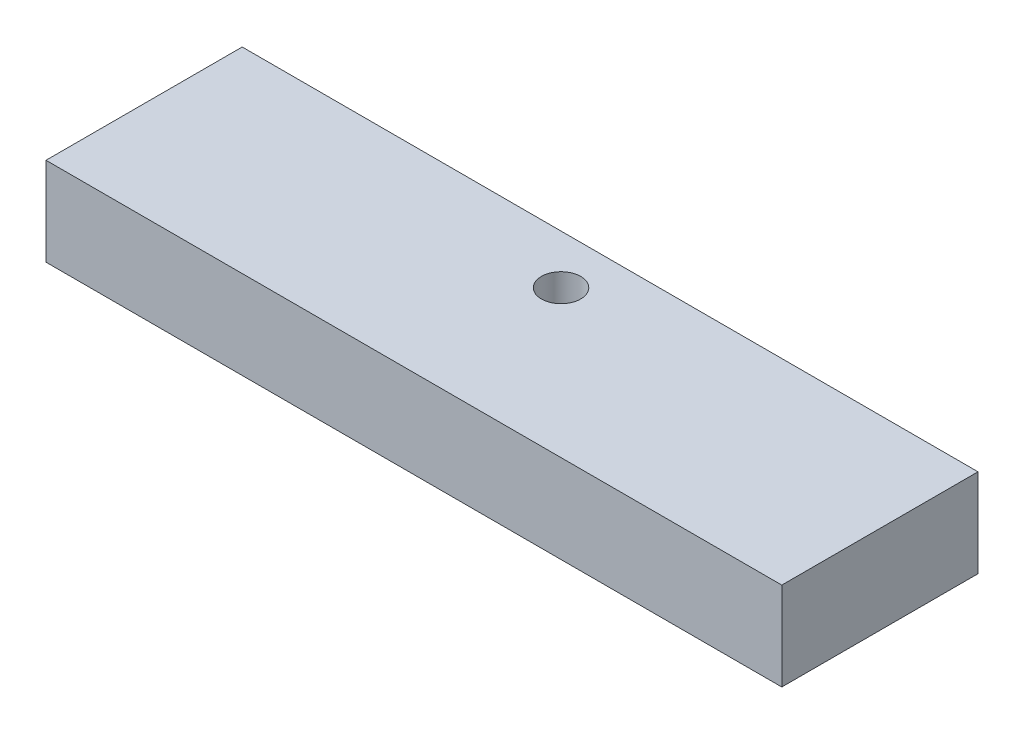
ISO-10303-21;
HEADER;
FILE_DESCRIPTION(('STEP AP214'),'2;1');
FILE_NAME('part.step','',(''),(''),'','','');
FILE_SCHEMA(('AUTOMOTIVE_DESIGN { 1 0 10303 214 1 1 1 1 }'));
ENDSEC;
DATA;
#1=APPLICATION_CONTEXT('core data for automotive mechanical design processes');
#2=APPLICATION_PROTOCOL_DEFINITION('international standard','automotive_design',2000,#1);
#3=PRODUCT_CONTEXT('',#1,'mechanical');
#4=PRODUCT('Part','Part','',(#3));
#5=PRODUCT_RELATED_PRODUCT_CATEGORY('part','',(#4));
#6=PRODUCT_DEFINITION_FORMATION('','',#4);
#7=PRODUCT_DEFINITION_CONTEXT('part definition',#1,'design');
#8=PRODUCT_DEFINITION('design','',#6,#7);
#9=PRODUCT_DEFINITION_SHAPE('','',#8);
#10=(LENGTH_UNIT() NAMED_UNIT(*) SI_UNIT(.MILLI.,.METRE.));
#11=(NAMED_UNIT(*) PLANE_ANGLE_UNIT() SI_UNIT($,.RADIAN.));
#12=(NAMED_UNIT(*) SI_UNIT($,.STERADIAN.) SOLID_ANGLE_UNIT());
#13=UNCERTAINTY_MEASURE_WITH_UNIT(LENGTH_MEASURE(1.E-05),#10,'distance_accuracy_value','');
#14=(GEOMETRIC_REPRESENTATION_CONTEXT(3) GLOBAL_UNCERTAINTY_ASSIGNED_CONTEXT((#13)) GLOBAL_UNIT_ASSIGNED_CONTEXT((#10,
#11,#12)) REPRESENTATION_CONTEXT('',''));
#15=CARTESIAN_POINT('',(0.,0.,0.));
#16=DIRECTION('',(0.,0.,1.));
#17=DIRECTION('',(1.,0.,0.));
#18=AXIS2_PLACEMENT_3D('',#15,#16,#17);
#19=CARTESIAN_POINT('',(0.,18.,0.));
#20=DIRECTION('',(0.,-1.,0.));
#21=DIRECTION('',(0.,0.,-1.));
#22=AXIS2_PLACEMENT_3D('',#19,#20,#21);
#23=PLANE('',#22);
#24=DIRECTION('',(0.,0.,-1.));
#25=VECTOR('',#24,1.);
#26=CARTESIAN_POINT('',(75.,18.,20.));
#27=LINE('',#26,#25);
#28=CARTESIAN_POINT('',(75.,18.,20.));
#29=VERTEX_POINT('',#28);
#30=CARTESIAN_POINT('',(75.,18.,-20.));
#31=VERTEX_POINT('',#30);
#32=EDGE_CURVE('E84',#29,#31,#27,.T.);
#33=ORIENTED_EDGE('',*,*,#32,.T.);
#34=DIRECTION('',(-1.,0.,0.));
#35=VECTOR('',#34,1.);
#36=CARTESIAN_POINT('',(-75.,18.,-20.));
#37=LINE('',#36,#35);
#38=CARTESIAN_POINT('',(-75.,18.,-20.));
#39=VERTEX_POINT('',#38);
#40=EDGE_CURVE('E79',#31,#39,#37,.T.);
#41=ORIENTED_EDGE('',*,*,#40,.T.);
#42=DIRECTION('',(0.,0.,1.));
#43=VECTOR('',#42,1.);
#44=CARTESIAN_POINT('',(-75.,18.,20.));
#45=LINE('',#44,#43);
#46=CARTESIAN_POINT('',(-75.,18.,20.));
#47=VERTEX_POINT('',#46);
#48=EDGE_CURVE('E82',#39,#47,#45,.T.);
#49=ORIENTED_EDGE('',*,*,#48,.T.);
#50=DIRECTION('',(1.,0.,0.));
#51=VECTOR('',#50,1.);
#52=CARTESIAN_POINT('',(-75.,18.,20.));
#53=LINE('',#52,#51);
#54=EDGE_CURVE('E49',#47,#29,#53,.T.);
#55=ORIENTED_EDGE('',*,*,#54,.T.);
#56=EDGE_LOOP('',(#33,#41,#49,#55));
#57=FACE_BOUND('',#56,.T.);
#58=CARTESIAN_POINT('',(0.,18.,-10.));
#59=DIRECTION('',(0.,1.,0.));
#60=DIRECTION('',(0.,0.,1.));
#61=AXIS2_PLACEMENT_3D('',#58,#59,#60);
#62=CIRCLE('',#61,4.);
#63=CARTESIAN_POINT('',(0.,18.,-6.00000000000002));
#64=VERTEX_POINT('',#63);
#65=EDGE_CURVE('E99',#64,#64,#62,.T.);
#66=ORIENTED_EDGE('',*,*,#65,.F.);
#67=EDGE_LOOP('',(#66));
#68=FACE_BOUND('',#67,.T.);
#69=ADVANCED_FACE('F32',(#57,#68),#23,.F.);
#70=CARTESIAN_POINT('',(0.,0.,0.));
#71=DIRECTION('',(0.,-1.,0.));
#72=DIRECTION('',(0.,0.,-1.));
#73=AXIS2_PLACEMENT_3D('',#70,#71,#72);
#74=PLANE('',#73);
#75=DIRECTION('',(0.,0.,-1.));
#76=VECTOR('',#75,1.);
#77=CARTESIAN_POINT('',(75.,0.,20.));
#78=LINE('',#77,#76);
#79=CARTESIAN_POINT('',(75.,0.,20.));
#80=VERTEX_POINT('',#79);
#81=CARTESIAN_POINT('',(75.,0.,-20.));
#82=VERTEX_POINT('',#81);
#83=EDGE_CURVE('E96',#80,#82,#78,.T.);
#84=ORIENTED_EDGE('',*,*,#83,.F.);
#85=DIRECTION('',(1.,0.,0.));
#86=VECTOR('',#85,1.);
#87=CARTESIAN_POINT('',(-75.,0.,20.));
#88=LINE('',#87,#86);
#89=CARTESIAN_POINT('',(-75.,0.,20.));
#90=VERTEX_POINT('',#89);
#91=EDGE_CURVE('E72',#90,#80,#88,.T.);
#92=ORIENTED_EDGE('',*,*,#91,.F.);
#93=DIRECTION('',(0.,0.,1.));
#94=VECTOR('',#93,1.);
#95=CARTESIAN_POINT('',(-75.,0.,20.));
#96=LINE('',#95,#94);
#97=CARTESIAN_POINT('',(-75.,0.,-20.));
#98=VERTEX_POINT('',#97);
#99=EDGE_CURVE('E66',#98,#90,#96,.T.);
#100=ORIENTED_EDGE('',*,*,#99,.F.);
#101=DIRECTION('',(-1.,0.,0.));
#102=VECTOR('',#101,1.);
#103=CARTESIAN_POINT('',(-75.,0.,-20.));
#104=LINE('',#103,#102);
#105=EDGE_CURVE('E88',#82,#98,#104,.T.);
#106=ORIENTED_EDGE('',*,*,#105,.F.);
#107=EDGE_LOOP('',(#84,#92,#100,#106));
#108=FACE_BOUND('',#107,.T.);
#109=CARTESIAN_POINT('',(0.,0.,-10.));
#110=DIRECTION('',(0.,1.,0.));
#111=DIRECTION('',(0.,0.,1.));
#112=AXIS2_PLACEMENT_3D('',#109,#110,#111);
#113=CIRCLE('',#112,4.);
#114=CARTESIAN_POINT('',(0.,0.,-6.00000000000002));
#115=VERTEX_POINT('',#114);
#116=EDGE_CURVE('E111',#115,#115,#113,.T.);
#117=ORIENTED_EDGE('',*,*,#116,.T.);
#118=EDGE_LOOP('',(#117));
#119=FACE_BOUND('',#118,.T.);
#120=ADVANCED_FACE('F107',(#108,#119),#74,.T.);
#121=CARTESIAN_POINT('',(75.,18.,20.));
#122=DIRECTION('',(-1.,0.,0.));
#123=DIRECTION('',(0.,0.,1.));
#124=AXIS2_PLACEMENT_3D('',#121,#122,#123);
#125=PLANE('',#124);
#126=ORIENTED_EDGE('',*,*,#83,.T.);
#127=DIRECTION('',(0.,-1.,0.));
#128=VECTOR('',#127,1.);
#129=CARTESIAN_POINT('',(75.,18.,-20.));
#130=LINE('',#129,#128);
#131=EDGE_CURVE('E11',#31,#82,#130,.T.);
#132=ORIENTED_EDGE('',*,*,#131,.F.);
#133=ORIENTED_EDGE('',*,*,#32,.F.);
#134=DIRECTION('',(0.,-1.,0.));
#135=VECTOR('',#134,1.);
#136=CARTESIAN_POINT('',(75.,18.,20.));
#137=LINE('',#136,#135);
#138=EDGE_CURVE('E92',#29,#80,#137,.T.);
#139=ORIENTED_EDGE('',*,*,#138,.T.);
#140=EDGE_LOOP('',(#126,#132,#133,#139));
#141=FACE_BOUND('',#140,.T.);
#142=ADVANCED_FACE('F34',(#141),#125,.F.);
#143=CARTESIAN_POINT('',(-75.,18.,-20.));
#144=DIRECTION('',(0.,0.,1.));
#145=DIRECTION('',(1.,0.,0.));
#146=AXIS2_PLACEMENT_3D('',#143,#144,#145);
#147=PLANE('',#146);
#148=ORIENTED_EDGE('',*,*,#105,.T.);
#149=DIRECTION('',(0.,-1.,0.));
#150=VECTOR('',#149,1.);
#151=CARTESIAN_POINT('',(-75.,18.,-20.));
#152=LINE('',#151,#150);
#153=EDGE_CURVE('E41',#39,#98,#152,.T.);
#154=ORIENTED_EDGE('',*,*,#153,.F.);
#155=ORIENTED_EDGE('',*,*,#40,.F.);
#156=ORIENTED_EDGE('',*,*,#131,.T.);
#157=EDGE_LOOP('',(#148,#154,#155,#156));
#158=FACE_BOUND('',#157,.T.);
#159=ADVANCED_FACE('F87',(#158),#147,.F.);
#160=CARTESIAN_POINT('',(-75.,18.,20.));
#161=DIRECTION('',(1.,0.,0.));
#162=DIRECTION('',(0.,0.,-1.));
#163=AXIS2_PLACEMENT_3D('',#160,#161,#162);
#164=PLANE('',#163);
#165=ORIENTED_EDGE('',*,*,#99,.T.);
#166=DIRECTION('',(0.,-1.,0.));
#167=VECTOR('',#166,1.);
#168=CARTESIAN_POINT('',(-75.,18.,20.));
#169=LINE('',#168,#167);
#170=EDGE_CURVE('E89',#47,#90,#169,.T.);
#171=ORIENTED_EDGE('',*,*,#170,.F.);
#172=ORIENTED_EDGE('',*,*,#48,.F.);
#173=ORIENTED_EDGE('',*,*,#153,.T.);
#174=EDGE_LOOP('',(#165,#171,#172,#173));
#175=FACE_BOUND('',#174,.T.);
#176=ADVANCED_FACE('F90',(#175),#164,.F.);
#177=CARTESIAN_POINT('',(-75.,18.,20.));
#178=DIRECTION('',(0.,0.,-1.));
#179=DIRECTION('',(-1.,0.,0.));
#180=AXIS2_PLACEMENT_3D('',#177,#178,#179);
#181=PLANE('',#180);
#182=ORIENTED_EDGE('',*,*,#91,.T.);
#183=ORIENTED_EDGE('',*,*,#138,.F.);
#184=ORIENTED_EDGE('',*,*,#54,.F.);
#185=ORIENTED_EDGE('',*,*,#170,.T.);
#186=EDGE_LOOP('',(#182,#183,#184,#185));
#187=FACE_BOUND('',#186,.T.);
#188=ADVANCED_FACE('F104',(#187),#181,.F.);
#189=CARTESIAN_POINT('',(0.,18.,-10.));
#190=DIRECTION('',(0.,-1.,0.));
#191=DIRECTION('',(0.,0.,-1.));
#192=AXIS2_PLACEMENT_3D('',#189,#190,#191);
#193=CYLINDRICAL_SURFACE('',#192,4.);
#194=ORIENTED_EDGE('',*,*,#65,.T.);
#195=EDGE_LOOP('',(#194));
#196=FACE_BOUND('',#195,.T.);
#197=ORIENTED_EDGE('',*,*,#116,.F.);
#198=EDGE_LOOP('',(#197));
#199=FACE_BOUND('',#198,.T.);
#200=ADVANCED_FACE('F117',(#196,#199),#193,.F.);
#201=CLOSED_SHELL('',(#69,#120,#142,#159,#176,#188,#200));
#202=MANIFOLD_SOLID_BREP('B2',#201);
#203=ADVANCED_BREP_SHAPE_REPRESENTATION('',(#18,#202),#14);
#204=SHAPE_DEFINITION_REPRESENTATION(#9,#203);
ENDSEC;
END-ISO-10303-21;
